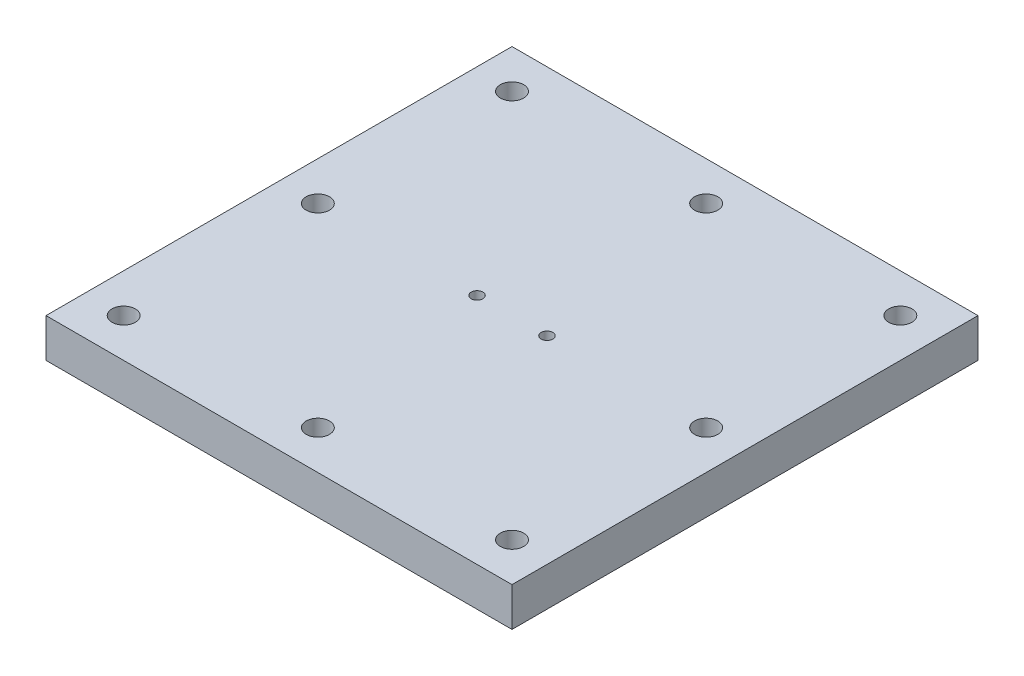
ISO-10303-21;
HEADER;
FILE_DESCRIPTION(('STEP AP214'),'2;1');
FILE_NAME('part.step','',(''),(''),'','','');
FILE_SCHEMA(('AUTOMOTIVE_DESIGN { 1 0 10303 214 1 1 1 1 }'));
ENDSEC;
DATA;
#1=APPLICATION_CONTEXT('core data for automotive mechanical design processes');
#2=APPLICATION_PROTOCOL_DEFINITION('international standard','automotive_design',2000,#1);
#3=PRODUCT_CONTEXT('',#1,'mechanical');
#4=PRODUCT('Part','Part','',(#3));
#5=PRODUCT_RELATED_PRODUCT_CATEGORY('part','',(#4));
#6=PRODUCT_DEFINITION_FORMATION('','',#4);
#7=PRODUCT_DEFINITION_CONTEXT('part definition',#1,'design');
#8=PRODUCT_DEFINITION('design','',#6,#7);
#9=PRODUCT_DEFINITION_SHAPE('','',#8);
#10=(LENGTH_UNIT() NAMED_UNIT(*) SI_UNIT(.MILLI.,.METRE.));
#11=(NAMED_UNIT(*) PLANE_ANGLE_UNIT() SI_UNIT($,.RADIAN.));
#12=(NAMED_UNIT(*) SI_UNIT($,.STERADIAN.) SOLID_ANGLE_UNIT());
#13=UNCERTAINTY_MEASURE_WITH_UNIT(LENGTH_MEASURE(1.E-05),#10,'distance_accuracy_value','');
#14=(GEOMETRIC_REPRESENTATION_CONTEXT(3) GLOBAL_UNCERTAINTY_ASSIGNED_CONTEXT((#13)) GLOBAL_UNIT_ASSIGNED_CONTEXT((#10,
#11,#12)) REPRESENTATION_CONTEXT('',''));
#15=CARTESIAN_POINT('',(0.,0.,0.));
#16=DIRECTION('',(0.,0.,1.));
#17=DIRECTION('',(1.,0.,0.));
#18=AXIS2_PLACEMENT_3D('',#15,#16,#17);
#19=CARTESIAN_POINT('',(0.,5.,-30.));
#20=DIRECTION('',(0.,0.,-1.));
#21=DIRECTION('',(-1.,0.,0.));
#22=AXIS2_PLACEMENT_3D('',#19,#20,#21);
#23=PLANE('',#22);
#24=DIRECTION('',(1.,0.,0.));
#25=VECTOR('',#24,1.);
#26=CARTESIAN_POINT('',(0.,0.,-30.));
#27=LINE('',#26,#25);
#28=CARTESIAN_POINT('',(-30.,0.,-30.));
#29=VERTEX_POINT('',#28);
#30=CARTESIAN_POINT('',(30.,0.,-30.));
#31=VERTEX_POINT('',#30);
#32=EDGE_CURVE('E150',#29,#31,#27,.T.);
#33=ORIENTED_EDGE('',*,*,#32,.F.);
#34=DIRECTION('',(0.,-1.,0.));
#35=VECTOR('',#34,1.);
#36=CARTESIAN_POINT('',(-30.,5.,-30.));
#37=LINE('',#36,#35);
#38=CARTESIAN_POINT('',(-30.,5.,-30.));
#39=VERTEX_POINT('',#38);
#40=EDGE_CURVE('E11',#39,#29,#37,.T.);
#41=ORIENTED_EDGE('',*,*,#40,.F.);
#42=DIRECTION('',(1.,0.,0.));
#43=VECTOR('',#42,1.);
#44=CARTESIAN_POINT('',(0.,5.,-30.));
#45=LINE('',#44,#43);
#46=CARTESIAN_POINT('',(30.,5.,-30.));
#47=VERTEX_POINT('',#46);
#48=EDGE_CURVE('E98',#39,#47,#45,.T.);
#49=ORIENTED_EDGE('',*,*,#48,.T.);
#50=DIRECTION('',(0.,-1.,0.));
#51=VECTOR('',#50,1.);
#52=CARTESIAN_POINT('',(30.,5.,-30.));
#53=LINE('',#52,#51);
#54=EDGE_CURVE('E58',#47,#31,#53,.T.);
#55=ORIENTED_EDGE('',*,*,#54,.T.);
#56=EDGE_LOOP('',(#33,#41,#49,#55));
#57=FACE_BOUND('',#56,.T.);
#58=ADVANCED_FACE('F40',(#57),#23,.T.);
#59=CARTESIAN_POINT('',(-30.,5.,0.));
#60=DIRECTION('',(1.,0.,0.));
#61=DIRECTION('',(0.,0.,-1.));
#62=AXIS2_PLACEMENT_3D('',#59,#60,#61);
#63=PLANE('',#62);
#64=DIRECTION('',(0.,0.,1.));
#65=VECTOR('',#64,1.);
#66=CARTESIAN_POINT('',(-30.,0.,0.));
#67=LINE('',#66,#65);
#68=CARTESIAN_POINT('',(-30.,0.,30.));
#69=VERTEX_POINT('',#68);
#70=EDGE_CURVE('E104',#29,#69,#67,.T.);
#71=ORIENTED_EDGE('',*,*,#70,.T.);
#72=DIRECTION('',(0.,-1.,0.));
#73=VECTOR('',#72,1.);
#74=CARTESIAN_POINT('',(-30.,5.,30.));
#75=LINE('',#74,#73);
#76=CARTESIAN_POINT('',(-30.,5.,30.));
#77=VERTEX_POINT('',#76);
#78=EDGE_CURVE('E50',#77,#69,#75,.T.);
#79=ORIENTED_EDGE('',*,*,#78,.F.);
#80=DIRECTION('',(0.,0.,1.));
#81=VECTOR('',#80,1.);
#82=CARTESIAN_POINT('',(-30.,5.,0.));
#83=LINE('',#82,#81);
#84=EDGE_CURVE('E93',#39,#77,#83,.T.);
#85=ORIENTED_EDGE('',*,*,#84,.F.);
#86=ORIENTED_EDGE('',*,*,#40,.T.);
#87=EDGE_LOOP('',(#71,#79,#85,#86));
#88=FACE_BOUND('',#87,.T.);
#89=ADVANCED_FACE('F102',(#88),#63,.F.);
#90=CARTESIAN_POINT('',(0.,5.,30.));
#91=DIRECTION('',(0.,0.,-1.));
#92=DIRECTION('',(-1.,0.,0.));
#93=AXIS2_PLACEMENT_3D('',#90,#91,#92);
#94=PLANE('',#93);
#95=DIRECTION('',(1.,0.,0.));
#96=VECTOR('',#95,1.);
#97=CARTESIAN_POINT('',(0.,0.,30.));
#98=LINE('',#97,#96);
#99=CARTESIAN_POINT('',(30.,0.,30.));
#100=VERTEX_POINT('',#99);
#101=EDGE_CURVE('E145',#69,#100,#98,.T.);
#102=ORIENTED_EDGE('',*,*,#101,.T.);
#103=DIRECTION('',(0.,-1.,0.));
#104=VECTOR('',#103,1.);
#105=CARTESIAN_POINT('',(30.,5.,30.));
#106=LINE('',#105,#104);
#107=CARTESIAN_POINT('',(30.,5.,30.));
#108=VERTEX_POINT('',#107);
#109=EDGE_CURVE('E72',#108,#100,#106,.T.);
#110=ORIENTED_EDGE('',*,*,#109,.F.);
#111=DIRECTION('',(1.,0.,0.));
#112=VECTOR('',#111,1.);
#113=CARTESIAN_POINT('',(0.,5.,30.));
#114=LINE('',#113,#112);
#115=EDGE_CURVE('E84',#77,#108,#114,.T.);
#116=ORIENTED_EDGE('',*,*,#115,.F.);
#117=ORIENTED_EDGE('',*,*,#78,.T.);
#118=EDGE_LOOP('',(#102,#110,#116,#117));
#119=FACE_BOUND('',#118,.T.);
#120=ADVANCED_FACE('F86',(#119),#94,.F.);
#121=CARTESIAN_POINT('',(-4.5,5.,0.));
#122=DIRECTION('',(0.,-1.,0.));
#123=DIRECTION('',(0.,0.,-1.));
#124=AXIS2_PLACEMENT_3D('',#121,#122,#123);
#125=CYLINDRICAL_SURFACE('',#124,0.750000000000002);
#126=CARTESIAN_POINT('',(-4.5,5.,0.));
#127=DIRECTION('',(0.,1.,0.));
#128=DIRECTION('',(0.,0.,1.));
#129=AXIS2_PLACEMENT_3D('',#126,#127,#128);
#130=CIRCLE('',#129,0.750000000000002);
#131=CARTESIAN_POINT('',(-4.5,5.,0.750000000000002));
#132=VERTEX_POINT('',#131);
#133=EDGE_CURVE('E168',#132,#132,#130,.T.);
#134=ORIENTED_EDGE('',*,*,#133,.T.);
#135=EDGE_LOOP('',(#134));
#136=FACE_BOUND('',#135,.T.);
#137=CARTESIAN_POINT('',(-4.5,0.,0.));
#138=DIRECTION('',(0.,1.,0.));
#139=DIRECTION('',(0.,0.,1.));
#140=AXIS2_PLACEMENT_3D('',#137,#138,#139);
#141=CIRCLE('',#140,0.750000000000002);
#142=CARTESIAN_POINT('',(-4.5,0.,0.750000000000002));
#143=VERTEX_POINT('',#142);
#144=EDGE_CURVE('E117',#143,#143,#141,.T.);
#145=ORIENTED_EDGE('',*,*,#144,.F.);
#146=EDGE_LOOP('',(#145));
#147=FACE_BOUND('',#146,.T.);
#148=ADVANCED_FACE('F351',(#136,#147),#125,.F.);
#149=CARTESIAN_POINT('',(-25.,5.,0.));
#150=DIRECTION('',(0.,-1.,0.));
#151=DIRECTION('',(0.,0.,-1.));
#152=AXIS2_PLACEMENT_3D('',#149,#150,#151);
#153=CYLINDRICAL_SURFACE('',#152,1.5);
#154=CARTESIAN_POINT('',(-25.,5.,0.));
#155=DIRECTION('',(0.,1.,0.));
#156=DIRECTION('',(0.,0.,1.));
#157=AXIS2_PLACEMENT_3D('',#154,#155,#156);
#158=CIRCLE('',#157,1.5);
#159=CARTESIAN_POINT('',(-25.,5.,1.5));
#160=VERTEX_POINT('',#159);
#161=EDGE_CURVE('E172',#160,#160,#158,.F.);
#162=ORIENTED_EDGE('',*,*,#161,.F.);
#163=EDGE_LOOP('',(#162));
#164=FACE_BOUND('',#163,.T.);
#165=CARTESIAN_POINT('',(-25.,0.,0.));
#166=DIRECTION('',(0.,1.,0.));
#167=DIRECTION('',(0.,0.,1.));
#168=AXIS2_PLACEMENT_3D('',#165,#166,#167);
#169=CIRCLE('',#168,1.5);
#170=CARTESIAN_POINT('',(-25.,0.,1.5));
#171=VERTEX_POINT('',#170);
#172=EDGE_CURVE('E121',#171,#171,#169,.F.);
#173=ORIENTED_EDGE('',*,*,#172,.T.);
#174=EDGE_LOOP('',(#173));
#175=FACE_BOUND('',#174,.T.);
#176=ADVANCED_FACE('F342',(#164,#175),#153,.F.);
#177=CARTESIAN_POINT('',(25.,5.,0.));
#178=DIRECTION('',(0.,-1.,0.));
#179=DIRECTION('',(0.,0.,-1.));
#180=AXIS2_PLACEMENT_3D('',#177,#178,#179);
#181=CYLINDRICAL_SURFACE('',#180,1.5);
#182=CARTESIAN_POINT('',(25.,5.,0.));
#183=DIRECTION('',(0.,1.,0.));
#184=DIRECTION('',(0.,0.,1.));
#185=AXIS2_PLACEMENT_3D('',#182,#183,#184);
#186=CIRCLE('',#185,1.5);
#187=CARTESIAN_POINT('',(25.,5.,1.5));
#188=VERTEX_POINT('',#187);
#189=EDGE_CURVE('E176',#188,#188,#186,.T.);
#190=ORIENTED_EDGE('',*,*,#189,.T.);
#191=EDGE_LOOP('',(#190));
#192=FACE_BOUND('',#191,.T.);
#193=CARTESIAN_POINT('',(25.,0.,0.));
#194=DIRECTION('',(0.,1.,0.));
#195=DIRECTION('',(0.,0.,1.));
#196=AXIS2_PLACEMENT_3D('',#193,#194,#195);
#197=CIRCLE('',#196,1.5);
#198=CARTESIAN_POINT('',(25.,0.,1.5));
#199=VERTEX_POINT('',#198);
#200=EDGE_CURVE('E125',#199,#199,#197,.T.);
#201=ORIENTED_EDGE('',*,*,#200,.F.);
#202=EDGE_LOOP('',(#201));
#203=FACE_BOUND('',#202,.T.);
#204=ADVANCED_FACE('F333',(#192,#203),#181,.F.);
#205=CARTESIAN_POINT('',(0.,5.,-25.));
#206=DIRECTION('',(0.,-1.,0.));
#207=DIRECTION('',(0.,0.,-1.));
#208=AXIS2_PLACEMENT_3D('',#205,#206,#207);
#209=CYLINDRICAL_SURFACE('',#208,1.5);
#210=CARTESIAN_POINT('',(0.,5.,-25.));
#211=DIRECTION('',(0.,1.,0.));
#212=DIRECTION('',(0.,0.,1.));
#213=AXIS2_PLACEMENT_3D('',#210,#211,#212);
#214=CIRCLE('',#213,1.5);
#215=CARTESIAN_POINT('',(0.,5.,-23.5));
#216=VERTEX_POINT('',#215);
#217=EDGE_CURVE('E180',#216,#216,#214,.T.);
#218=ORIENTED_EDGE('',*,*,#217,.T.);
#219=EDGE_LOOP('',(#218));
#220=FACE_BOUND('',#219,.T.);
#221=CARTESIAN_POINT('',(0.,0.,-25.));
#222=DIRECTION('',(0.,1.,0.));
#223=DIRECTION('',(0.,0.,1.));
#224=AXIS2_PLACEMENT_3D('',#221,#222,#223);
#225=CIRCLE('',#224,1.5);
#226=CARTESIAN_POINT('',(0.,0.,-23.5));
#227=VERTEX_POINT('',#226);
#228=EDGE_CURVE('E129',#227,#227,#225,.T.);
#229=ORIENTED_EDGE('',*,*,#228,.F.);
#230=EDGE_LOOP('',(#229));
#231=FACE_BOUND('',#230,.T.);
#232=ADVANCED_FACE('F324',(#220,#231),#209,.F.);
#233=CARTESIAN_POINT('',(25.,5.,25.));
#234=DIRECTION('',(0.,-1.,0.));
#235=DIRECTION('',(0.,0.,-1.));
#236=AXIS2_PLACEMENT_3D('',#233,#234,#235);
#237=CYLINDRICAL_SURFACE('',#236,1.5);
#238=CARTESIAN_POINT('',(25.,5.,25.));
#239=DIRECTION('',(0.,1.,0.));
#240=DIRECTION('',(0.,0.,1.));
#241=AXIS2_PLACEMENT_3D('',#238,#239,#240);
#242=CIRCLE('',#241,1.5);
#243=CARTESIAN_POINT('',(25.,5.,26.5));
#244=VERTEX_POINT('',#243);
#245=EDGE_CURVE('E184',#244,#244,#242,.F.);
#246=ORIENTED_EDGE('',*,*,#245,.F.);
#247=EDGE_LOOP('',(#246));
#248=FACE_BOUND('',#247,.T.);
#249=CARTESIAN_POINT('',(25.,0.,25.));
#250=DIRECTION('',(0.,1.,0.));
#251=DIRECTION('',(0.,0.,1.));
#252=AXIS2_PLACEMENT_3D('',#249,#250,#251);
#253=CIRCLE('',#252,1.5);
#254=CARTESIAN_POINT('',(25.,0.,26.5));
#255=VERTEX_POINT('',#254);
#256=EDGE_CURVE('E133',#255,#255,#253,.F.);
#257=ORIENTED_EDGE('',*,*,#256,.T.);
#258=EDGE_LOOP('',(#257));
#259=FACE_BOUND('',#258,.T.);
#260=ADVANCED_FACE('F315',(#248,#259),#237,.F.);
#261=CARTESIAN_POINT('',(25.,5.,-25.));
#262=DIRECTION('',(0.,-1.,0.));
#263=DIRECTION('',(0.,0.,-1.));
#264=AXIS2_PLACEMENT_3D('',#261,#262,#263);
#265=CYLINDRICAL_SURFACE('',#264,1.5);
#266=CARTESIAN_POINT('',(25.,5.,-25.));
#267=DIRECTION('',(0.,1.,0.));
#268=DIRECTION('',(0.,0.,1.));
#269=AXIS2_PLACEMENT_3D('',#266,#267,#268);
#270=CIRCLE('',#269,1.5);
#271=CARTESIAN_POINT('',(25.,5.,-23.5));
#272=VERTEX_POINT('',#271);
#273=EDGE_CURVE('E188',#272,#272,#270,.T.);
#274=ORIENTED_EDGE('',*,*,#273,.T.);
#275=EDGE_LOOP('',(#274));
#276=FACE_BOUND('',#275,.T.);
#277=CARTESIAN_POINT('',(25.,0.,-25.));
#278=DIRECTION('',(0.,1.,0.));
#279=DIRECTION('',(0.,0.,1.));
#280=AXIS2_PLACEMENT_3D('',#277,#278,#279);
#281=CIRCLE('',#280,1.5);
#282=CARTESIAN_POINT('',(25.,0.,-23.5));
#283=VERTEX_POINT('',#282);
#284=EDGE_CURVE('E137',#283,#283,#281,.T.);
#285=ORIENTED_EDGE('',*,*,#284,.F.);
#286=EDGE_LOOP('',(#285));
#287=FACE_BOUND('',#286,.T.);
#288=ADVANCED_FACE('F307',(#276,#287),#265,.F.);
#289=CARTESIAN_POINT('',(30.,5.,0.));
#290=DIRECTION('',(1.,0.,0.));
#291=DIRECTION('',(0.,0.,-1.));
#292=AXIS2_PLACEMENT_3D('',#289,#290,#291);
#293=PLANE('',#292);
#294=DIRECTION('',(0.,0.,1.));
#295=VECTOR('',#294,1.);
#296=CARTESIAN_POINT('',(30.,0.,0.));
#297=LINE('',#296,#295);
#298=EDGE_CURVE('E141',#31,#100,#297,.T.);
#299=ORIENTED_EDGE('',*,*,#298,.F.);
#300=ORIENTED_EDGE('',*,*,#54,.F.);
#301=DIRECTION('',(0.,0.,1.));
#302=VECTOR('',#301,1.);
#303=CARTESIAN_POINT('',(30.,5.,0.));
#304=LINE('',#303,#302);
#305=EDGE_CURVE('E92',#47,#108,#304,.T.);
#306=ORIENTED_EDGE('',*,*,#305,.T.);
#307=ORIENTED_EDGE('',*,*,#109,.T.);
#308=EDGE_LOOP('',(#299,#300,#306,#307));
#309=FACE_BOUND('',#308,.T.);
#310=ADVANCED_FACE('F258',(#309),#293,.T.);
#311=CARTESIAN_POINT('',(-25.,5.,25.));
#312=DIRECTION('',(0.,-1.,0.));
#313=DIRECTION('',(0.,0.,-1.));
#314=AXIS2_PLACEMENT_3D('',#311,#312,#313);
#315=CYLINDRICAL_SURFACE('',#314,1.5);
#316=CARTESIAN_POINT('',(-25.,5.,25.));
#317=DIRECTION('',(0.,1.,0.));
#318=DIRECTION('',(0.,0.,1.));
#319=AXIS2_PLACEMENT_3D('',#316,#317,#318);
#320=CIRCLE('',#319,1.5);
#321=CARTESIAN_POINT('',(-25.,5.,26.5));
#322=VERTEX_POINT('',#321);
#323=EDGE_CURVE('E196',#322,#322,#320,.T.);
#324=ORIENTED_EDGE('',*,*,#323,.T.);
#325=EDGE_LOOP('',(#324));
#326=FACE_BOUND('',#325,.T.);
#327=CARTESIAN_POINT('',(-25.,0.,25.));
#328=DIRECTION('',(0.,1.,0.));
#329=DIRECTION('',(0.,0.,1.));
#330=AXIS2_PLACEMENT_3D('',#327,#328,#329);
#331=CIRCLE('',#330,1.5);
#332=CARTESIAN_POINT('',(-25.,0.,26.5));
#333=VERTEX_POINT('',#332);
#334=EDGE_CURVE('E153',#333,#333,#331,.T.);
#335=ORIENTED_EDGE('',*,*,#334,.F.);
#336=EDGE_LOOP('',(#335));
#337=FACE_BOUND('',#336,.T.);
#338=ADVANCED_FACE('F256',(#326,#337),#315,.F.);
#339=CARTESIAN_POINT('',(-25.,5.,-25.));
#340=DIRECTION('',(0.,-1.,0.));
#341=DIRECTION('',(0.,0.,-1.));
#342=AXIS2_PLACEMENT_3D('',#339,#340,#341);
#343=CYLINDRICAL_SURFACE('',#342,1.5);
#344=CARTESIAN_POINT('',(-25.,5.,-25.));
#345=DIRECTION('',(0.,1.,0.));
#346=DIRECTION('',(0.,0.,1.));
#347=AXIS2_PLACEMENT_3D('',#344,#345,#346);
#348=CIRCLE('',#347,1.5);
#349=CARTESIAN_POINT('',(-25.,5.,-23.5));
#350=VERTEX_POINT('',#349);
#351=EDGE_CURVE('E200',#350,#350,#348,.F.);
#352=ORIENTED_EDGE('',*,*,#351,.F.);
#353=EDGE_LOOP('',(#352));
#354=FACE_BOUND('',#353,.T.);
#355=CARTESIAN_POINT('',(-25.,0.,-25.));
#356=DIRECTION('',(0.,1.,0.));
#357=DIRECTION('',(0.,0.,1.));
#358=AXIS2_PLACEMENT_3D('',#355,#356,#357);
#359=CIRCLE('',#358,1.5);
#360=CARTESIAN_POINT('',(-25.,0.,-23.5));
#361=VERTEX_POINT('',#360);
#362=EDGE_CURVE('E157',#361,#361,#359,.F.);
#363=ORIENTED_EDGE('',*,*,#362,.T.);
#364=EDGE_LOOP('',(#363));
#365=FACE_BOUND('',#364,.T.);
#366=ADVANCED_FACE('F213',(#354,#365),#343,.F.);
#367=CARTESIAN_POINT('',(0.,5.,25.));
#368=DIRECTION('',(0.,-1.,0.));
#369=DIRECTION('',(0.,0.,-1.));
#370=AXIS2_PLACEMENT_3D('',#367,#368,#369);
#371=CYLINDRICAL_SURFACE('',#370,1.5);
#372=CARTESIAN_POINT('',(0.,5.,25.));
#373=DIRECTION('',(0.,1.,0.));
#374=DIRECTION('',(0.,0.,1.));
#375=AXIS2_PLACEMENT_3D('',#372,#373,#374);
#376=CIRCLE('',#375,1.5);
#377=CARTESIAN_POINT('',(0.,5.,26.5));
#378=VERTEX_POINT('',#377);
#379=EDGE_CURVE('E116',#378,#378,#376,.F.);
#380=ORIENTED_EDGE('',*,*,#379,.F.);
#381=EDGE_LOOP('',(#380));
#382=FACE_BOUND('',#381,.T.);
#383=CARTESIAN_POINT('',(0.,0.,25.));
#384=DIRECTION('',(0.,1.,0.));
#385=DIRECTION('',(0.,0.,1.));
#386=AXIS2_PLACEMENT_3D('',#383,#384,#385);
#387=CIRCLE('',#386,1.5);
#388=CARTESIAN_POINT('',(0.,0.,26.5));
#389=VERTEX_POINT('',#388);
#390=EDGE_CURVE('E161',#389,#389,#387,.F.);
#391=ORIENTED_EDGE('',*,*,#390,.T.);
#392=EDGE_LOOP('',(#391));
#393=FACE_BOUND('',#392,.T.);
#394=ADVANCED_FACE('F42',(#382,#393),#371,.F.);
#395=CARTESIAN_POINT('',(4.50000000000001,5.,0.));
#396=DIRECTION('',(0.,-1.,0.));
#397=DIRECTION('',(0.,0.,-1.));
#398=AXIS2_PLACEMENT_3D('',#395,#396,#397);
#399=CYLINDRICAL_SURFACE('',#398,0.750000000000002);
#400=CARTESIAN_POINT('',(4.50000000000001,5.,0.));
#401=DIRECTION('',(0.,1.,0.));
#402=DIRECTION('',(0.,0.,1.));
#403=AXIS2_PLACEMENT_3D('',#400,#401,#402);
#404=CIRCLE('',#403,0.750000000000002);
#405=CARTESIAN_POINT('',(4.50000000000001,5.,0.750000000000001));
#406=VERTEX_POINT('',#405);
#407=EDGE_CURVE('E111',#406,#406,#404,.F.);
#408=ORIENTED_EDGE('',*,*,#407,.F.);
#409=EDGE_LOOP('',(#408));
#410=FACE_BOUND('',#409,.T.);
#411=CARTESIAN_POINT('',(4.50000000000001,0.,0.));
#412=DIRECTION('',(0.,1.,0.));
#413=DIRECTION('',(0.,0.,1.));
#414=AXIS2_PLACEMENT_3D('',#411,#412,#413);
#415=CIRCLE('',#414,0.750000000000002);
#416=CARTESIAN_POINT('',(4.50000000000001,0.,0.750000000000001));
#417=VERTEX_POINT('',#416);
#418=EDGE_CURVE('E112',#417,#417,#415,.F.);
#419=ORIENTED_EDGE('',*,*,#418,.T.);
#420=EDGE_LOOP('',(#419));
#421=FACE_BOUND('',#420,.T.);
#422=ADVANCED_FACE('F212',(#410,#421),#399,.F.);
#423=CARTESIAN_POINT('',(0.,5.,0.));
#424=DIRECTION('',(0.,1.,0.));
#425=DIRECTION('',(0.,0.,1.));
#426=AXIS2_PLACEMENT_3D('',#423,#424,#425);
#427=PLANE('',#426);
#428=ORIENTED_EDGE('',*,*,#379,.T.);
#429=EDGE_LOOP('',(#428));
#430=FACE_BOUND('',#429,.T.);
#431=ORIENTED_EDGE('',*,*,#351,.T.);
#432=EDGE_LOOP('',(#431));
#433=FACE_BOUND('',#432,.T.);
#434=ORIENTED_EDGE('',*,*,#323,.F.);
#435=EDGE_LOOP('',(#434));
#436=FACE_BOUND('',#435,.T.);
#437=ORIENTED_EDGE('',*,*,#48,.F.);
#438=ORIENTED_EDGE('',*,*,#84,.T.);
#439=ORIENTED_EDGE('',*,*,#115,.T.);
#440=ORIENTED_EDGE('',*,*,#305,.F.);
#441=EDGE_LOOP('',(#437,#438,#439,#440));
#442=FACE_BOUND('',#441,.T.);
#443=ORIENTED_EDGE('',*,*,#273,.F.);
#444=EDGE_LOOP('',(#443));
#445=FACE_BOUND('',#444,.T.);
#446=ORIENTED_EDGE('',*,*,#245,.T.);
#447=EDGE_LOOP('',(#446));
#448=FACE_BOUND('',#447,.T.);
#449=ORIENTED_EDGE('',*,*,#217,.F.);
#450=EDGE_LOOP('',(#449));
#451=FACE_BOUND('',#450,.T.);
#452=ORIENTED_EDGE('',*,*,#189,.F.);
#453=EDGE_LOOP('',(#452));
#454=FACE_BOUND('',#453,.T.);
#455=ORIENTED_EDGE('',*,*,#161,.T.);
#456=EDGE_LOOP('',(#455));
#457=FACE_BOUND('',#456,.T.);
#458=ORIENTED_EDGE('',*,*,#133,.F.);
#459=EDGE_LOOP('',(#458));
#460=FACE_BOUND('',#459,.T.);
#461=ORIENTED_EDGE('',*,*,#407,.T.);
#462=EDGE_LOOP('',(#461));
#463=FACE_BOUND('',#462,.T.);
#464=ADVANCED_FACE('F96',(#430,#433,#436,#442,#445,#448,#451,#454,#457,#460,#463),#427,.T.);
#465=CARTESIAN_POINT('',(0.,0.,0.));
#466=DIRECTION('',(0.,1.,0.));
#467=DIRECTION('',(0.,0.,1.));
#468=AXIS2_PLACEMENT_3D('',#465,#466,#467);
#469=PLANE('',#468);
#470=ORIENTED_EDGE('',*,*,#390,.F.);
#471=EDGE_LOOP('',(#470));
#472=FACE_BOUND('',#471,.T.);
#473=ORIENTED_EDGE('',*,*,#362,.F.);
#474=EDGE_LOOP('',(#473));
#475=FACE_BOUND('',#474,.T.);
#476=ORIENTED_EDGE('',*,*,#334,.T.);
#477=EDGE_LOOP('',(#476));
#478=FACE_BOUND('',#477,.T.);
#479=ORIENTED_EDGE('',*,*,#32,.T.);
#480=ORIENTED_EDGE('',*,*,#298,.T.);
#481=ORIENTED_EDGE('',*,*,#101,.F.);
#482=ORIENTED_EDGE('',*,*,#70,.F.);
#483=EDGE_LOOP('',(#479,#480,#481,#482));
#484=FACE_BOUND('',#483,.T.);
#485=ORIENTED_EDGE('',*,*,#284,.T.);
#486=EDGE_LOOP('',(#485));
#487=FACE_BOUND('',#486,.T.);
#488=ORIENTED_EDGE('',*,*,#256,.F.);
#489=EDGE_LOOP('',(#488));
#490=FACE_BOUND('',#489,.T.);
#491=ORIENTED_EDGE('',*,*,#228,.T.);
#492=EDGE_LOOP('',(#491));
#493=FACE_BOUND('',#492,.T.);
#494=ORIENTED_EDGE('',*,*,#200,.T.);
#495=EDGE_LOOP('',(#494));
#496=FACE_BOUND('',#495,.T.);
#497=ORIENTED_EDGE('',*,*,#172,.F.);
#498=EDGE_LOOP('',(#497));
#499=FACE_BOUND('',#498,.T.);
#500=ORIENTED_EDGE('',*,*,#144,.T.);
#501=EDGE_LOOP('',(#500));
#502=FACE_BOUND('',#501,.T.);
#503=ORIENTED_EDGE('',*,*,#418,.F.);
#504=EDGE_LOOP('',(#503));
#505=FACE_BOUND('',#504,.T.);
#506=ADVANCED_FACE('F216',(#472,#475,#478,#484,#487,#490,#493,#496,#499,#502,#505),#469,.F.);
#507=CLOSED_SHELL('',(#58,#89,#120,#148,#176,#204,#232,#260,#288,#310,#338,#366,#394,#422,#464,#506));
#508=MANIFOLD_SOLID_BREP('B2',#507);
#509=ADVANCED_BREP_SHAPE_REPRESENTATION('',(#18,#508),#14);
#510=SHAPE_DEFINITION_REPRESENTATION(#9,#509);
ENDSEC;
END-ISO-10303-21;
